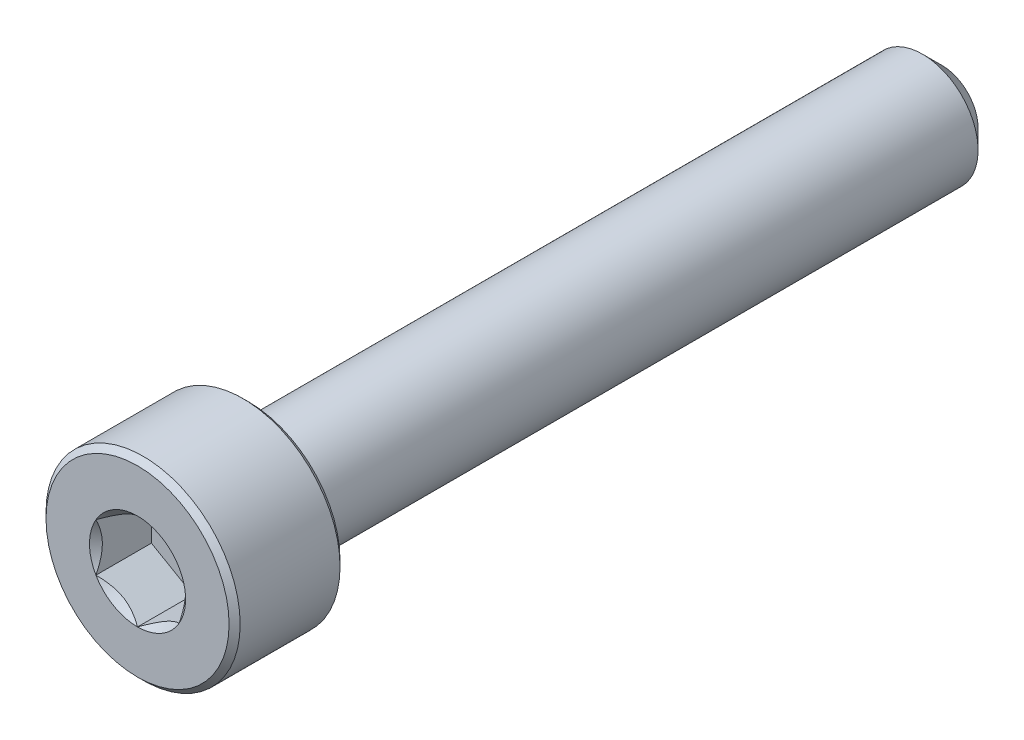
ISO-10303-21;
HEADER;
FILE_DESCRIPTION(('STEP AP214'),'2;1');
FILE_NAME('part.step','',(''),(''),'','','');
FILE_SCHEMA(('AUTOMOTIVE_DESIGN { 1 0 10303 214 1 1 1 1 }'));
ENDSEC;
DATA;
#1=APPLICATION_CONTEXT('core data for automotive mechanical design processes');
#2=APPLICATION_PROTOCOL_DEFINITION('international standard','automotive_design',2000,#1);
#3=PRODUCT_CONTEXT('',#1,'mechanical');
#4=PRODUCT('Part','Part','',(#3));
#5=PRODUCT_RELATED_PRODUCT_CATEGORY('part','',(#4));
#6=PRODUCT_DEFINITION_FORMATION('','',#4);
#7=PRODUCT_DEFINITION_CONTEXT('part definition',#1,'design');
#8=PRODUCT_DEFINITION('design','',#6,#7);
#9=PRODUCT_DEFINITION_SHAPE('','',#8);
#10=(LENGTH_UNIT() NAMED_UNIT(*) SI_UNIT(.MILLI.,.METRE.));
#11=(NAMED_UNIT(*) PLANE_ANGLE_UNIT() SI_UNIT($,.RADIAN.));
#12=(NAMED_UNIT(*) SI_UNIT($,.STERADIAN.) SOLID_ANGLE_UNIT());
#13=UNCERTAINTY_MEASURE_WITH_UNIT(LENGTH_MEASURE(1.E-05),#10,'distance_accuracy_value','');
#14=(GEOMETRIC_REPRESENTATION_CONTEXT(3) GLOBAL_UNCERTAINTY_ASSIGNED_CONTEXT((#13)) GLOBAL_UNIT_ASSIGNED_CONTEXT((#10,
#11,#12)) REPRESENTATION_CONTEXT('',''));
#15=CARTESIAN_POINT('',(0.,0.,0.));
#16=DIRECTION('',(0.,0.,1.));
#17=DIRECTION('',(1.,0.,0.));
#18=AXIS2_PLACEMENT_3D('',#15,#16,#17);
#19=CARTESIAN_POINT('',(0.,3.3,14.5));
#20=DIRECTION('',(0.,0.,1.));
#21=DIRECTION('',(1.,0.,0.));
#22=AXIS2_PLACEMENT_3D('',#19,#20,#21);
#23=PLANE('',#22);
#24=CARTESIAN_POINT('',(0.,0.,14.5));
#25=DIRECTION('',(0.,0.,1.));
#26=DIRECTION('',(1.,0.,0.));
#27=AXIS2_PLACEMENT_3D('',#24,#25,#26);
#28=CIRCLE('',#27,1.73205080756888);
#29=CARTESIAN_POINT('',(1.5,0.86602540378444,14.5));
#30=VERTEX_POINT('',#29);
#31=CARTESIAN_POINT('',(0.,1.73205080756888,14.5));
#32=VERTEX_POINT('',#31);
#33=EDGE_CURVE('E99',#30,#32,#28,.T.);
#34=ORIENTED_EDGE('',*,*,#33,.F.);
#35=CARTESIAN_POINT('',(1.5,-0.86602540378444,14.5));
#36=VERTEX_POINT('',#35);
#37=EDGE_CURVE('E59',#36,#30,#28,.T.);
#38=ORIENTED_EDGE('',*,*,#37,.F.);
#39=CARTESIAN_POINT('',(0.,-1.73205080756888,14.5));
#40=VERTEX_POINT('',#39);
#41=EDGE_CURVE('E309',#40,#36,#28,.T.);
#42=ORIENTED_EDGE('',*,*,#41,.F.);
#43=CARTESIAN_POINT('',(-1.5,-0.866025403784437,14.5));
#44=VERTEX_POINT('',#43);
#45=EDGE_CURVE('E66',#44,#40,#28,.T.);
#46=ORIENTED_EDGE('',*,*,#45,.F.);
#47=CARTESIAN_POINT('',(-1.5,0.86602540378444,14.5));
#48=VERTEX_POINT('',#47);
#49=EDGE_CURVE('E138',#48,#44,#28,.T.);
#50=ORIENTED_EDGE('',*,*,#49,.F.);
#51=EDGE_CURVE('E109',#32,#48,#28,.T.);
#52=ORIENTED_EDGE('',*,*,#51,.F.);
#53=EDGE_LOOP('',(#34,#38,#42,#46,#50,#52));
#54=FACE_BOUND('',#53,.T.);
#55=CARTESIAN_POINT('',(0.,0.,14.5));
#56=DIRECTION('',(0.,0.,-1.));
#57=DIRECTION('',(-1.,0.,0.));
#58=AXIS2_PLACEMENT_3D('',#55,#56,#57);
#59=CIRCLE('',#58,3.3);
#60=CARTESIAN_POINT('',(-3.3,0.,14.5));
#61=VERTEX_POINT('',#60);
#62=EDGE_CURVE('E53',#61,#61,#59,.T.);
#63=ORIENTED_EDGE('',*,*,#62,.F.);
#64=EDGE_LOOP('',(#63));
#65=FACE_BOUND('',#64,.T.);
#66=ADVANCED_FACE('F39',(#54,#65),#23,.T.);
#67=CARTESIAN_POINT('',(0.,0.,14.3));
#68=DIRECTION('',(0.,0.,-1.));
#69=DIRECTION('',(-1.,0.,0.));
#70=AXIS2_PLACEMENT_3D('',#67,#68,#69);
#71=CONICAL_SURFACE('',#70,3.5,0.785398163397442);
#72=ORIENTED_EDGE('',*,*,#62,.T.);
#73=EDGE_LOOP('',(#72));
#74=FACE_BOUND('',#73,.T.);
#75=CARTESIAN_POINT('',(0.,0.,14.3));
#76=DIRECTION('',(0.,0.,-1.));
#77=DIRECTION('',(-1.,0.,0.));
#78=AXIS2_PLACEMENT_3D('',#75,#76,#77);
#79=CIRCLE('',#78,3.5);
#80=CARTESIAN_POINT('',(-3.5,0.,14.3));
#81=VERTEX_POINT('',#80);
#82=EDGE_CURVE('E241',#81,#81,#79,.T.);
#83=ORIENTED_EDGE('',*,*,#82,.F.);
#84=EDGE_LOOP('',(#83));
#85=FACE_BOUND('',#84,.T.);
#86=ADVANCED_FACE('F248',(#74,#85),#71,.T.);
#87=CARTESIAN_POINT('',(0.,0.,-14.5));
#88=DIRECTION('',(0.,0.,-1.));
#89=DIRECTION('',(-1.,0.,0.));
#90=AXIS2_PLACEMENT_3D('',#87,#88,#89);
#91=CYLINDRICAL_SURFACE('',#90,3.5);
#92=ORIENTED_EDGE('',*,*,#82,.T.);
#93=EDGE_LOOP('',(#92));
#94=FACE_BOUND('',#93,.T.);
#95=CARTESIAN_POINT('',(0.,0.,10.7));
#96=DIRECTION('',(0.,0.,-1.));
#97=DIRECTION('',(-1.,0.,0.));
#98=AXIS2_PLACEMENT_3D('',#95,#96,#97);
#99=CIRCLE('',#98,3.5);
#100=CARTESIAN_POINT('',(-3.5,0.,10.7));
#101=VERTEX_POINT('',#100);
#102=EDGE_CURVE('E237',#101,#101,#99,.T.);
#103=ORIENTED_EDGE('',*,*,#102,.F.);
#104=EDGE_LOOP('',(#103));
#105=FACE_BOUND('',#104,.T.);
#106=ADVANCED_FACE('F254',(#94,#105),#91,.T.);
#107=CARTESIAN_POINT('',(0.,0.,10.5));
#108=DIRECTION('',(0.,0.,1.));
#109=DIRECTION('',(1.,0.,0.));
#110=AXIS2_PLACEMENT_3D('',#107,#108,#109);
#111=CONICAL_SURFACE('',#110,3.3,0.78539816339745);
#112=ORIENTED_EDGE('',*,*,#102,.T.);
#113=EDGE_LOOP('',(#112));
#114=FACE_BOUND('',#113,.T.);
#115=CARTESIAN_POINT('',(0.,0.,10.5));
#116=DIRECTION('',(0.,0.,-1.));
#117=DIRECTION('',(-1.,0.,0.));
#118=AXIS2_PLACEMENT_3D('',#115,#116,#117);
#119=CIRCLE('',#118,3.3);
#120=CARTESIAN_POINT('',(-3.3,0.,10.5));
#121=VERTEX_POINT('',#120);
#122=EDGE_CURVE('E233',#121,#121,#119,.T.);
#123=ORIENTED_EDGE('',*,*,#122,.F.);
#124=EDGE_LOOP('',(#123));
#125=FACE_BOUND('',#124,.T.);
#126=ADVANCED_FACE('F258',(#114,#125),#111,.T.);
#127=CARTESIAN_POINT('',(0.,3.3,10.5));
#128=DIRECTION('',(0.,0.,-1.));
#129=DIRECTION('',(-1.,0.,0.));
#130=AXIS2_PLACEMENT_3D('',#127,#128,#129);
#131=PLANE('',#130);
#132=ORIENTED_EDGE('',*,*,#122,.T.);
#133=EDGE_LOOP('',(#132));
#134=FACE_BOUND('',#133,.T.);
#135=CARTESIAN_POINT('',(0.,0.,10.5));
#136=DIRECTION('',(0.,0.,-1.));
#137=DIRECTION('',(-1.,0.,0.));
#138=AXIS2_PLACEMENT_3D('',#135,#136,#137);
#139=CIRCLE('',#138,2.);
#140=CARTESIAN_POINT('',(-2.,0.,10.5));
#141=VERTEX_POINT('',#140);
#142=EDGE_CURVE('E229',#141,#141,#139,.T.);
#143=ORIENTED_EDGE('',*,*,#142,.F.);
#144=EDGE_LOOP('',(#143));
#145=FACE_BOUND('',#144,.T.);
#146=ADVANCED_FACE('F264',(#134,#145),#131,.T.);
#147=CARTESIAN_POINT('',(0.,0.,-14.5));
#148=DIRECTION('',(0.,0.,-1.));
#149=DIRECTION('',(-1.,0.,0.));
#150=AXIS2_PLACEMENT_3D('',#147,#148,#149);
#151=CYLINDRICAL_SURFACE('',#150,2.);
#152=ORIENTED_EDGE('',*,*,#142,.T.);
#153=EDGE_LOOP('',(#152));
#154=FACE_BOUND('',#153,.T.);
#155=CARTESIAN_POINT('',(0.,0.,-13.8));
#156=DIRECTION('',(0.,0.,-1.));
#157=DIRECTION('',(-1.,0.,0.));
#158=AXIS2_PLACEMENT_3D('',#155,#156,#157);
#159=CIRCLE('',#158,2.);
#160=CARTESIAN_POINT('',(-2.,0.,-13.8));
#161=VERTEX_POINT('',#160);
#162=EDGE_CURVE('E225',#161,#161,#159,.T.);
#163=ORIENTED_EDGE('',*,*,#162,.F.);
#164=EDGE_LOOP('',(#163));
#165=FACE_BOUND('',#164,.T.);
#166=ADVANCED_FACE('F268',(#154,#165),#151,.T.);
#167=CARTESIAN_POINT('',(0.,0.,-14.5));
#168=DIRECTION('',(0.,0.,1.));
#169=DIRECTION('',(1.,0.,0.));
#170=AXIS2_PLACEMENT_3D('',#167,#168,#169);
#171=CONICAL_SURFACE('',#170,1.3,0.785398163397441);
#172=ORIENTED_EDGE('',*,*,#162,.T.);
#173=EDGE_LOOP('',(#172));
#174=FACE_BOUND('',#173,.T.);
#175=CARTESIAN_POINT('',(0.,0.,-14.5));
#176=DIRECTION('',(0.,0.,-1.));
#177=DIRECTION('',(-1.,0.,0.));
#178=AXIS2_PLACEMENT_3D('',#175,#176,#177);
#179=CIRCLE('',#178,1.3);
#180=CARTESIAN_POINT('',(-1.3,0.,-14.5));
#181=VERTEX_POINT('',#180);
#182=EDGE_CURVE('E208',#181,#181,#179,.T.);
#183=ORIENTED_EDGE('',*,*,#182,.F.);
#184=EDGE_LOOP('',(#183));
#185=FACE_BOUND('',#184,.T.);
#186=ADVANCED_FACE('F271',(#174,#185),#171,.T.);
#187=CARTESIAN_POINT('',(0.,1.3,-14.5));
#188=DIRECTION('',(0.,0.,-1.));
#189=DIRECTION('',(-1.,0.,0.));
#190=AXIS2_PLACEMENT_3D('',#187,#188,#189);
#191=PLANE('',#190);
#192=ORIENTED_EDGE('',*,*,#182,.T.);
#193=EDGE_LOOP('',(#192));
#194=FACE_BOUND('',#193,.T.);
#195=ADVANCED_FACE('F174',(#194),#191,.T.);
#196=CARTESIAN_POINT('',(0.,0.,14.5));
#197=DIRECTION('',(0.,0.,1.));
#198=DIRECTION('',(1.,0.,0.));
#199=AXIS2_PLACEMENT_3D('',#196,#197,#198);
#200=CONICAL_SURFACE('',#199,1.73205080756888,0.78539816339745);
#201=ORIENTED_EDGE('',*,*,#51,.T.);
#202=CARTESIAN_POINT('',(0.000200000000000415,1.73216627762272,14.5001154816001));
#203=CARTESIAN_POINT('',(-0.0513677907370748,1.70239359975915,14.4703654760673));
#204=CARTESIAN_POINT('',(-0.1037979176652,1.67212305186355,14.4423624839103));
#205=CARTESIAN_POINT('',(-0.210709034055596,1.61039789003619,14.3910892304401));
#206=CARTESIAN_POINT('',(-0.26520019581466,1.57893740312614,14.3678475050444));
#207=CARTESIAN_POINT('',(-0.375079081357248,1.51549879897987,14.3280337289922));
#208=CARTESIAN_POINT('',(-0.430438809095199,1.4835368452681,14.3113615856709));
#209=CARTESIAN_POINT('',(-0.54237725747715,1.41890915196211,14.2856744568181));
#210=CARTESIAN_POINT('',(-0.598952556553008,1.38624538781118,14.2766402904789));
#211=CARTESIAN_POINT('',(-0.69645538951644,1.329952100953,14.2684890812269));
#212=CARTESIAN_POINT('',(-0.737256908280465,1.30639533311124,14.2672822529892));
#213=CARTESIAN_POINT('',(-0.818787969615858,1.25932335290194,14.2693140571623));
#214=CARTESIAN_POINT('',(-0.859517494314629,1.23580815085313,14.2725536707483));
#215=CARTESIAN_POINT('',(-0.940584402163415,1.18900414978427,14.283291985982));
#216=CARTESIAN_POINT('',(-0.980921384598287,1.1657155821172,14.2907946530187));
#217=CARTESIAN_POINT('',(-1.06091833691403,1.11952932016335,14.3096516119283));
#218=CARTESIAN_POINT('',(-1.10057800851621,1.09663179808786,14.3210075570186));
#219=CARTESIAN_POINT('',(-1.20216313477448,1.03798159809698,14.3547216475927));
#220=CARTESIAN_POINT('',(-1.26345855370969,1.00259267147465,14.3796218490934));
#221=CARTESIAN_POINT('',(-1.35358562846331,0.950557780604375,14.4216566532716));
#222=CARTESIAN_POINT('',(-1.38328513990772,0.933410759677148,14.4364251535591));
#223=CARTESIAN_POINT('',(-1.44213790138375,0.899432101996407,14.4673105659402));
#224=CARTESIAN_POINT('',(-1.47129140422064,0.88260031928571,14.4834268341217));
#225=CARTESIAN_POINT('',(-1.5002,0.865909933730601,14.5001154816001));
#226=B_SPLINE_CURVE_WITH_KNOTS('',3,(#202,#203,#204,#205,#206,#207,#208,#209,#210,#211,#212,
#213,#214,#215,#216,#217,#218,#219,#220,#221,#222,#223,#224,#225),.UNSPECIFIED.,.F.,.F.,(4,2,2,
2,2,2,2,2,2,2,2,4),(0.,0.199829143693304,0.400822987382388,0.59862372053818,0.795926240188889,
0.937113067959881,1.07833105577193,1.21968061668222,1.36109089931054,1.58570969637566,
1.69770705470964,1.80965120737194),.UNSPECIFIED.);
#227=EDGE_CURVE('E11',#32,#48,#226,.T.);
#228=ORIENTED_EDGE('',*,*,#227,.F.);
#229=EDGE_LOOP('',(#201,#228));
#230=FACE_BOUND('',#229,.T.);
#231=ADVANCED_FACE('F113',(#230),#200,.F.);
#232=ORIENTED_EDGE('',*,*,#49,.T.);
#233=CARTESIAN_POINT('',(-1.5,-1.70094076570699,15.0358115093375));
#234=CARTESIAN_POINT('',(-1.5,-1.65940339844307,15.0046624535631));
#235=CARTESIAN_POINT('',(-1.5,-1.61763176138548,14.9738266460381));
#236=CARTESIAN_POINT('',(-1.5,-1.53352581710889,14.9129100581704));
#237=CARTESIAN_POINT('',(-1.5,-1.49119136858461,14.8828294731344));
#238=CARTESIAN_POINT('',(-1.5,-1.36258344501966,14.7934848296331));
#239=CARTESIAN_POINT('',(-1.5,-1.27533705988673,14.7355978134878));
#240=CARTESIAN_POINT('',(-1.5,-1.09255216894207,14.6221956742968));
#241=CARTESIAN_POINT('',(-1.5,-0.996821581803491,14.5669865475731));
#242=CARTESIAN_POINT('',(-1.5,-0.80061308229159,14.4661637894456));
#243=CARTESIAN_POINT('',(-1.5,-0.700152604862087,14.4205178517796));
#244=CARTESIAN_POINT('',(-1.5,-0.549105960820993,14.3646825296987));
#245=CARTESIAN_POINT('',(-1.5,-0.50070074362804,14.3486143923262));
#246=CARTESIAN_POINT('',(-1.5,-0.40274469507941,14.3203677225147));
#247=CARTESIAN_POINT('',(-1.5,-0.353193782853662,14.3081894655512));
#248=CARTESIAN_POINT('',(-1.5,-0.254057869430009,14.2885509139904));
#249=CARTESIAN_POINT('',(-1.5,-0.204488814603775,14.2810113615859));
#250=CARTESIAN_POINT('',(-1.5,-0.104849462627796,14.2707932169289));
#251=CARTESIAN_POINT('',(-1.5,-0.0547792475757581,14.2681138411974));
#252=CARTESIAN_POINT('',(-1.5,0.0436737229088438,14.2678046268618));
#253=CARTESIAN_POINT('',(-1.5,0.0920560164094801,14.2700063307259));
#254=CARTESIAN_POINT('',(-1.5,0.188397733218518,14.2789725882362));
#255=CARTESIAN_POINT('',(-1.5,0.236357072029981,14.285738033594));
#256=CARTESIAN_POINT('',(-1.5,0.332310053939587,14.3035816390129));
#257=CARTESIAN_POINT('',(-1.5,0.380290051019947,14.3147320967868));
#258=CARTESIAN_POINT('',(-1.5,0.475204866701383,14.3407610618773));
#259=CARTESIAN_POINT('',(-1.5,0.522139781196709,14.3556392256008));
#260=CARTESIAN_POINT('',(-1.5,0.67113584923772,14.4084343926817));
#261=CARTESIAN_POINT('',(-1.5,0.771043708402957,14.4524144964364));
#262=CARTESIAN_POINT('',(-1.5,0.96615432077171,14.5501619481606));
#263=CARTESIAN_POINT('',(-1.5,1.06133841027247,14.6039647104964));
#264=CARTESIAN_POINT('',(-1.5,1.24322962123133,14.7149242663436));
#265=CARTESIAN_POINT('',(-1.5,1.33012275327054,14.7717798884629));
#266=CARTESIAN_POINT('',(-1.5,1.45814294533514,14.8596557398234));
#267=CARTESIAN_POINT('',(-1.5,1.50026316125082,14.8892542436258));
#268=CARTESIAN_POINT('',(-1.5,1.58392901779071,14.9492295725282));
#269=CARTESIAN_POINT('',(-1.5,1.62547481197907,14.9796061831648));
#270=CARTESIAN_POINT('',(-1.5,1.66678158585385,15.0103052870204));
#271=B_SPLINE_CURVE_WITH_KNOTS('',3,(#233,#234,#235,#236,#237,#238,#239,#240,#241,#242,#243,
#244,#245,#246,#247,#248,#249,#250,#251,#252,#253,#254,#255,#256,#257,#258,#259,#260,#261,#262,
#263,#264,#265,#266,#267,#268,#269,#270),.UNSPECIFIED.,.F.,.F.,(4,2,2,2,2,2,2,2,2,2,2,2,2,2,2,2,
2,2,4),(0.,0.155753948201002,0.311547769199354,0.625513832410583,0.95676361465448,
1.28687565594417,1.43975300144579,1.59264117109685,1.74283872260253,1.89301205954152,
2.03808349452257,2.1831832832956,2.33078307442231,2.47836926586908,2.80488410158813,
3.13260026706957,3.44396956433299,3.59840353500356,3.75279538879849),.UNSPECIFIED.);
#272=EDGE_CURVE('E108',#48,#44,#271,.F.);
#273=ORIENTED_EDGE('',*,*,#272,.F.);
#274=EDGE_LOOP('',(#232,#273));
#275=FACE_BOUND('',#274,.T.);
#276=ADVANCED_FACE('F286',(#275),#200,.F.);
#277=ORIENTED_EDGE('',*,*,#45,.T.);
#278=CARTESIAN_POINT('',(-1.5002,-0.865909933730601,14.5001154816001));
#279=CARTESIAN_POINT('',(-1.44863220926292,-0.895682611594166,14.4703654760673));
#280=CARTESIAN_POINT('',(-1.3962020823348,-0.925953159489765,14.4423624839103));
#281=CARTESIAN_POINT('',(-1.2892909659444,-0.987678321317123,14.3910892304401));
#282=CARTESIAN_POINT('',(-1.23479980418534,-1.01913880822717,14.3678475050444));
#283=CARTESIAN_POINT('',(-1.12492091864275,-1.08257741237344,14.3280337289922));
#284=CARTESIAN_POINT('',(-1.0695611909048,-1.11453936608521,14.3113615856709));
#285=CARTESIAN_POINT('',(-0.957622742522851,-1.1791670593912,14.2856744568181));
#286=CARTESIAN_POINT('',(-0.901047443446993,-1.21183082354213,14.2766402904789));
#287=CARTESIAN_POINT('',(-0.803544610483561,-1.26812411040032,14.2684890812269));
#288=CARTESIAN_POINT('',(-0.762743091719535,-1.29168087824208,14.2672822529892));
#289=CARTESIAN_POINT('',(-0.681212030384143,-1.33875285845138,14.2693140571623));
#290=CARTESIAN_POINT('',(-0.640482505685372,-1.36226806050018,14.2725536707483));
#291=CARTESIAN_POINT('',(-0.559415597836586,-1.40907206156905,14.283291985982));
#292=CARTESIAN_POINT('',(-0.519078615401714,-1.43236062923612,14.2907946530187));
#293=CARTESIAN_POINT('',(-0.439081663085971,-1.47854689118996,14.3096516119283));
#294=CARTESIAN_POINT('',(-0.399421991483794,-1.50144441326545,14.3210075570186));
#295=CARTESIAN_POINT('',(-0.297836865225516,-1.56009461325633,14.3547216475927));
#296=CARTESIAN_POINT('',(-0.236541446290312,-1.59548353987866,14.3796218490934));
#297=CARTESIAN_POINT('',(-0.146414371536687,-1.64751843074894,14.4216566532716));
#298=CARTESIAN_POINT('',(-0.116714860092283,-1.66466545167617,14.4364251535591));
#299=CARTESIAN_POINT('',(-0.0578620986162496,-1.69864410935691,14.4673105659402));
#300=CARTESIAN_POINT('',(-0.0287085957793634,-1.71547589206761,14.4834268341217));
#301=CARTESIAN_POINT('',(0.000199999999999558,-1.73216627762272,14.5001154816001));
#302=B_SPLINE_CURVE_WITH_KNOTS('',3,(#278,#279,#280,#281,#282,#283,#284,#285,#286,#287,#288,
#289,#290,#291,#292,#293,#294,#295,#296,#297,#298,#299,#300,#301),.UNSPECIFIED.,.F.,.F.,(4,2,2,
2,2,2,2,2,2,2,2,4),(0.,0.199829143693304,0.400822987382388,0.59862372053818,0.795926240188888,
0.93711306795988,1.07833105577193,1.21968061668222,1.36109089931054,1.58570969637565,
1.69770705470964,1.80965120737194),.UNSPECIFIED.);
#303=EDGE_CURVE('E150',#44,#40,#302,.T.);
#304=ORIENTED_EDGE('',*,*,#303,.F.);
#305=EDGE_LOOP('',(#277,#304));
#306=FACE_BOUND('',#305,.T.);
#307=ADVANCED_FACE('F290',(#306),#200,.F.);
#308=ORIENTED_EDGE('',*,*,#41,.T.);
#309=CARTESIAN_POINT('',(-0.000200000000000533,-1.73216627762272,14.5001154816001));
#310=CARTESIAN_POINT('',(0.0513677907370749,-1.70239359975915,14.4703654760673));
#311=CARTESIAN_POINT('',(0.1037979176652,-1.67212305186355,14.4423624839103));
#312=CARTESIAN_POINT('',(0.210709034055596,-1.61039789003619,14.3910892304401));
#313=CARTESIAN_POINT('',(0.26520019581466,-1.57893740312614,14.3678475050444));
#314=CARTESIAN_POINT('',(0.375079081357248,-1.51549879897987,14.3280337289922));
#315=CARTESIAN_POINT('',(0.430438809095199,-1.4835368452681,14.3113615856709));
#316=CARTESIAN_POINT('',(0.54237725747715,-1.41890915196211,14.2856744568181));
#317=CARTESIAN_POINT('',(0.598952556553008,-1.38624538781118,14.2766402904789));
#318=CARTESIAN_POINT('',(0.69645538951644,-1.329952100953,14.2684890812269));
#319=CARTESIAN_POINT('',(0.737256908280465,-1.30639533311124,14.2672822529892));
#320=CARTESIAN_POINT('',(0.818787969615857,-1.25932335290194,14.2693140571623));
#321=CARTESIAN_POINT('',(0.859517494314629,-1.23580815085313,14.2725536707483));
#322=CARTESIAN_POINT('',(0.940584402163415,-1.18900414978427,14.283291985982));
#323=CARTESIAN_POINT('',(0.980921384598287,-1.1657155821172,14.2907946530187));
#324=CARTESIAN_POINT('',(1.06091833691403,-1.11952932016335,14.3096516119283));
#325=CARTESIAN_POINT('',(1.10057800851621,-1.09663179808786,14.3210075570186));
#326=CARTESIAN_POINT('',(1.20216313477448,-1.03798159809698,14.3547216475927));
#327=CARTESIAN_POINT('',(1.26345855370969,-1.00259267147465,14.3796218490934));
#328=CARTESIAN_POINT('',(1.35358562846331,-0.950557780604376,14.4216566532716));
#329=CARTESIAN_POINT('',(1.38328513990772,-0.933410759677149,14.4364251535591));
#330=CARTESIAN_POINT('',(1.44213790138375,-0.899432101996408,14.4673105659402));
#331=CARTESIAN_POINT('',(1.47129140422064,-0.882600319285711,14.4834268341217));
#332=CARTESIAN_POINT('',(1.5002,-0.865909933730602,14.5001154816001));
#333=B_SPLINE_CURVE_WITH_KNOTS('',3,(#309,#310,#311,#312,#313,#314,#315,#316,#317,#318,#319,
#320,#321,#322,#323,#324,#325,#326,#327,#328,#329,#330,#331,#332),.UNSPECIFIED.,.F.,.F.,(4,2,2,
2,2,2,2,2,2,2,2,4),(0.,0.199829143693304,0.400822987382388,0.59862372053818,0.795926240188889,
0.93711306795988,1.07833105577193,1.21968061668222,1.36109089931054,1.58570969637565,
1.69770705470963,1.80965120737194),.UNSPECIFIED.);
#334=EDGE_CURVE('E311',#40,#36,#333,.T.);
#335=ORIENTED_EDGE('',*,*,#334,.F.);
#336=EDGE_LOOP('',(#308,#335));
#337=FACE_BOUND('',#336,.T.);
#338=ADVANCED_FACE('F299',(#337),#200,.F.);
#339=ORIENTED_EDGE('',*,*,#37,.T.);
#340=CARTESIAN_POINT('',(1.5,-1.70094076506827,15.0358115088584));
#341=CARTESIAN_POINT('',(1.5,-1.65940339782208,15.0046624531024));
#342=CARTESIAN_POINT('',(1.5,-1.61763176078228,14.9738266455959));
#343=CARTESIAN_POINT('',(1.5,-1.53352581654145,14.9129100577648));
#344=CARTESIAN_POINT('',(1.5,-1.49119136803515,14.882829472747));
#345=CARTESIAN_POINT('',(1.5,-1.36258344452521,14.793484829301));
#346=CARTESIAN_POINT('',(1.5,-1.2753370594297,14.7355978131923));
#347=CARTESIAN_POINT('',(1.5,-1.09255216856664,14.6221956740766));
#348=CARTESIAN_POINT('',(1.5,-0.996821581472455,14.5669865473912));
#349=CARTESIAN_POINT('',(1.5,-0.800613082053126,14.4661637893348));
#350=CARTESIAN_POINT('',(1.5,-0.70015260467177,14.4205178517016));
#351=CARTESIAN_POINT('',(1.5,-0.549105960667007,14.3646825296453));
#352=CARTESIAN_POINT('',(1.5,-0.500700743459034,14.3486143922722));
#353=CARTESIAN_POINT('',(1.5,-0.402744694879907,14.3203677224624));
#354=CARTESIAN_POINT('',(1.5,-0.35319378263868,14.3081894655014));
#355=CARTESIAN_POINT('',(1.5,-0.254057869184596,14.2885509139489));
#356=CARTESIAN_POINT('',(1.5,-0.204488814343417,14.2810113615502));
#357=CARTESIAN_POINT('',(1.5,-0.104849462338083,14.2707932169081));
#358=CARTESIAN_POINT('',(1.5,-0.0547792472716361,14.2681138411859));
#359=CARTESIAN_POINT('',(1.5,0.0436737232403028,14.267804626871));
#360=CARTESIAN_POINT('',(1.5,0.0920560167539031,14.2700063307466));
#361=CARTESIAN_POINT('',(1.5,0.188397733587633,14.2789725882818));
#362=CARTESIAN_POINT('',(1.5,0.236357072410824,14.2857380336531));
#363=CARTESIAN_POINT('',(1.5,0.332310054343575,14.3035816391));
#364=CARTESIAN_POINT('',(1.5,0.380290051435318,14.3147320968888));
#365=CARTESIAN_POINT('',(1.5,0.475204867138458,14.3407610620092));
#366=CARTESIAN_POINT('',(1.5,0.522139781644104,14.3556392257479));
#367=CARTESIAN_POINT('',(1.5,0.671135849783408,14.4084343929006));
#368=CARTESIAN_POINT('',(1.5,0.771043709031689,14.4524144967216));
#369=CARTESIAN_POINT('',(1.5,0.96615432156016,14.5501619485856));
#370=CARTESIAN_POINT('',(1.5,1.06133841113756,14.603964710995));
#371=CARTESIAN_POINT('',(1.5,1.24322962223427,14.714924266983));
#372=CARTESIAN_POINT('',(1.5,1.33012275433518,14.7717798891689));
#373=CARTESIAN_POINT('',(1.5,1.45814294649102,14.859655740629));
#374=CARTESIAN_POINT('',(1.5,1.50026316243668,14.8892542444644));
#375=CARTESIAN_POINT('',(1.5,1.58392901903632,14.9492295734326));
#376=CARTESIAN_POINT('',(1.5,1.62547481325447,14.9796061841021));
#377=CARTESIAN_POINT('',(1.5,1.66678158715899,15.0103052879905));
#378=B_SPLINE_CURVE_WITH_KNOTS('',3,(#340,#341,#342,#343,#344,#345,#346,#347,#348,#349,#350,
#351,#352,#353,#354,#355,#356,#357,#358,#359,#360,#361,#362,#363,#364,#365,#366,#367,#368,#369,
#370,#371,#372,#373,#374,#375,#376,#377),.UNSPECIFIED.,.F.,.F.,(4,2,2,2,2,2,2,2,2,2,2,2,2,2,2,2,
2,2,4),(0.,0.155753948125309,0.311547769047943,0.625513832104915,0.95676361417602,
1.28687565529455,1.43975300083937,1.59264117053357,1.74283872208071,1.89301205906115,
2.03808349408246,2.18318328289585,2.33078307406584,2.47836926555587,2.80488410158167,
3.13260026737189,3.44396956489968,3.59840353570064,3.75279538962595),.UNSPECIFIED.);
#379=EDGE_CURVE('E126',#36,#30,#378,.T.);
#380=ORIENTED_EDGE('',*,*,#379,.F.);
#381=EDGE_LOOP('',(#339,#380));
#382=FACE_BOUND('',#381,.T.);
#383=ADVANCED_FACE('F293',(#382),#200,.F.);
#384=ORIENTED_EDGE('',*,*,#33,.T.);
#385=CARTESIAN_POINT('',(1.5002,0.865909933730602,14.5001154816001));
#386=CARTESIAN_POINT('',(1.44863220926292,0.895682611594167,14.4703654760673));
#387=CARTESIAN_POINT('',(1.3962020823348,0.925953159489766,14.4423624839103));
#388=CARTESIAN_POINT('',(1.2892909659444,0.987678321317125,14.3910892304401));
#389=CARTESIAN_POINT('',(1.23479980418534,1.01913880822718,14.3678475050444));
#390=CARTESIAN_POINT('',(1.12492091864275,1.08257741237344,14.3280337289922));
#391=CARTESIAN_POINT('',(1.0695611909048,1.11453936608522,14.3113615856709));
#392=CARTESIAN_POINT('',(0.957622742522848,1.1791670593912,14.2856744568181));
#393=CARTESIAN_POINT('',(0.90104744344699,1.21183082354213,14.2766402904789));
#394=CARTESIAN_POINT('',(0.803544610483558,1.26812411040032,14.2684890812269));
#395=CARTESIAN_POINT('',(0.762743091719533,1.29168087824208,14.2672822529892));
#396=CARTESIAN_POINT('',(0.681212030384141,1.33875285845138,14.2693140571623));
#397=CARTESIAN_POINT('',(0.640482505685369,1.36226806050018,14.2725536707483));
#398=CARTESIAN_POINT('',(0.559415597836583,1.40907206156905,14.283291985982));
#399=CARTESIAN_POINT('',(0.51907861540171,1.43236062923612,14.2907946530187));
#400=CARTESIAN_POINT('',(0.439081663085968,1.47854689118997,14.3096516119283));
#401=CARTESIAN_POINT('',(0.399421991483791,1.50144441326545,14.3210075570186));
#402=CARTESIAN_POINT('',(0.297836865225514,1.56009461325633,14.3547216475927));
#403=CARTESIAN_POINT('',(0.23654144629031,1.59548353987866,14.3796218490934));
#404=CARTESIAN_POINT('',(0.146414371536686,1.64751843074894,14.4216566532716));
#405=CARTESIAN_POINT('',(0.116714860092281,1.66466545167617,14.4364251535591));
#406=CARTESIAN_POINT('',(0.0578620986162485,1.69864410935691,14.4673105659402));
#407=CARTESIAN_POINT('',(0.0287085957793627,1.71547589206761,14.4834268341217));
#408=CARTESIAN_POINT('',(-0.000199999999999666,1.73216627762272,14.5001154816001));
#409=B_SPLINE_CURVE_WITH_KNOTS('',3,(#385,#386,#387,#388,#389,#390,#391,#392,#393,#394,#395,
#396,#397,#398,#399,#400,#401,#402,#403,#404,#405,#406,#407,#408),.UNSPECIFIED.,.F.,.F.,(4,2,2,
2,2,2,2,2,2,2,2,4),(0.,0.199829143693305,0.400822987382389,0.598623720538181,0.795926240188889,
0.937113067959881,1.07833105577193,1.21968061668222,1.36109089931055,1.58570969637565,
1.69770705470964,1.80965120737194),.UNSPECIFIED.);
#410=EDGE_CURVE('E103',#30,#32,#409,.T.);
#411=ORIENTED_EDGE('',*,*,#410,.F.);
#412=EDGE_LOOP('',(#384,#411));
#413=FACE_BOUND('',#412,.T.);
#414=ADVANCED_FACE('F101',(#413),#200,.F.);
#415=CARTESIAN_POINT('',(0.,0.,12.5));
#416=DIRECTION('',(0.,0.,1.));
#417=DIRECTION('',(1.,0.,0.));
#418=AXIS2_PLACEMENT_3D('',#415,#416,#417);
#419=PLANE('',#418);
#420=DIRECTION('',(-0.866025403784439,0.5,0.));
#421=VECTOR('',#420,1.);
#422=CARTESIAN_POINT('',(1.5,0.86602540378444,12.5));
#423=LINE('',#422,#421);
#424=CARTESIAN_POINT('',(1.5,0.86602540378444,12.5));
#425=VERTEX_POINT('',#424);
#426=CARTESIAN_POINT('',(0.,1.73205080756888,12.5));
#427=VERTEX_POINT('',#426);
#428=EDGE_CURVE('E125',#425,#427,#423,.T.);
#429=ORIENTED_EDGE('',*,*,#428,.T.);
#430=DIRECTION('',(-0.866025403784439,-0.5,0.));
#431=VECTOR('',#430,1.);
#432=CARTESIAN_POINT('',(0.,1.73205080756888,12.5));
#433=LINE('',#432,#431);
#434=CARTESIAN_POINT('',(-1.5,0.866025403784439,12.5));
#435=VERTEX_POINT('',#434);
#436=EDGE_CURVE('E130',#427,#435,#433,.T.);
#437=ORIENTED_EDGE('',*,*,#436,.T.);
#438=DIRECTION('',(0.,-1.,0.));
#439=VECTOR('',#438,1.);
#440=CARTESIAN_POINT('',(-1.5,0.866025403784439,12.5));
#441=LINE('',#440,#439);
#442=CARTESIAN_POINT('',(-1.5,-0.866025403784439,12.5));
#443=VERTEX_POINT('',#442);
#444=EDGE_CURVE('E191',#435,#443,#441,.T.);
#445=ORIENTED_EDGE('',*,*,#444,.T.);
#446=DIRECTION('',(0.866025403784439,-0.5,0.));
#447=VECTOR('',#446,1.);
#448=CARTESIAN_POINT('',(-1.5,-0.866025403784439,12.5));
#449=LINE('',#448,#447);
#450=CARTESIAN_POINT('',(0.,-1.73205080756888,12.5));
#451=VERTEX_POINT('',#450);
#452=EDGE_CURVE('E195',#443,#451,#449,.T.);
#453=ORIENTED_EDGE('',*,*,#452,.T.);
#454=DIRECTION('',(0.866025403784439,0.5,0.));
#455=VECTOR('',#454,1.);
#456=CARTESIAN_POINT('',(0.,-1.73205080756888,12.5));
#457=LINE('',#456,#455);
#458=CARTESIAN_POINT('',(1.5,-0.86602540378444,12.5));
#459=VERTEX_POINT('',#458);
#460=EDGE_CURVE('E199',#451,#459,#457,.T.);
#461=ORIENTED_EDGE('',*,*,#460,.T.);
#462=DIRECTION('',(0.,1.,0.));
#463=VECTOR('',#462,1.);
#464=CARTESIAN_POINT('',(1.5,-0.86602540378444,12.5));
#465=LINE('',#464,#463);
#466=EDGE_CURVE('E134',#459,#425,#465,.T.);
#467=ORIENTED_EDGE('',*,*,#466,.T.);
#468=EDGE_LOOP('',(#429,#437,#445,#453,#461,#467));
#469=FACE_BOUND('',#468,.T.);
#470=ADVANCED_FACE('F169',(#469),#419,.T.);
#471=CARTESIAN_POINT('',(0.,1.73205080756888,12.5));
#472=DIRECTION('',(-0.5,0.866025403784439,0.));
#473=DIRECTION('',(-0.866025403784439,-0.5,0.));
#474=AXIS2_PLACEMENT_3D('',#471,#472,#473);
#475=PLANE('',#474);
#476=DIRECTION('',(0.,0.,1.));
#477=VECTOR('',#476,1.);
#478=CARTESIAN_POINT('',(0.,1.73205080756888,12.5));
#479=LINE('',#478,#477);
#480=EDGE_CURVE('E121',#427,#32,#479,.T.);
#481=ORIENTED_EDGE('',*,*,#480,.T.);
#482=ORIENTED_EDGE('',*,*,#227,.T.);
#483=DIRECTION('',(0.,0.,1.));
#484=VECTOR('',#483,1.);
#485=CARTESIAN_POINT('',(-1.5,0.866025403784439,12.5));
#486=LINE('',#485,#484);
#487=EDGE_CURVE('E133',#435,#48,#486,.T.);
#488=ORIENTED_EDGE('',*,*,#487,.F.);
#489=ORIENTED_EDGE('',*,*,#436,.F.);
#490=EDGE_LOOP('',(#481,#482,#488,#489));
#491=FACE_BOUND('',#490,.T.);
#492=ADVANCED_FACE('F128',(#491),#475,.F.);
#493=CARTESIAN_POINT('',(-1.5,0.866025403784439,12.5));
#494=DIRECTION('',(-1.,0.,0.));
#495=DIRECTION('',(0.,-1.,0.));
#496=AXIS2_PLACEMENT_3D('',#493,#494,#495);
#497=PLANE('',#496);
#498=ORIENTED_EDGE('',*,*,#487,.T.);
#499=ORIENTED_EDGE('',*,*,#272,.T.);
#500=DIRECTION('',(0.,0.,1.));
#501=VECTOR('',#500,1.);
#502=CARTESIAN_POINT('',(-1.5,-0.866025403784439,12.5));
#503=LINE('',#502,#501);
#504=EDGE_CURVE('E216',#443,#44,#503,.T.);
#505=ORIENTED_EDGE('',*,*,#504,.F.);
#506=ORIENTED_EDGE('',*,*,#444,.F.);
#507=EDGE_LOOP('',(#498,#499,#505,#506));
#508=FACE_BOUND('',#507,.T.);
#509=ADVANCED_FACE('F159',(#508),#497,.F.);
#510=CARTESIAN_POINT('',(-1.5,-0.866025403784439,12.5));
#511=DIRECTION('',(-0.5,-0.866025403784439,0.));
#512=DIRECTION('',(0.866025403784439,-0.5,0.));
#513=AXIS2_PLACEMENT_3D('',#510,#511,#512);
#514=PLANE('',#513);
#515=ORIENTED_EDGE('',*,*,#504,.T.);
#516=ORIENTED_EDGE('',*,*,#303,.T.);
#517=DIRECTION('',(0.,0.,1.));
#518=VECTOR('',#517,1.);
#519=CARTESIAN_POINT('',(0.,-1.73205080756888,12.5));
#520=LINE('',#519,#518);
#521=EDGE_CURVE('E212',#451,#40,#520,.T.);
#522=ORIENTED_EDGE('',*,*,#521,.F.);
#523=ORIENTED_EDGE('',*,*,#452,.F.);
#524=EDGE_LOOP('',(#515,#516,#522,#523));
#525=FACE_BOUND('',#524,.T.);
#526=ADVANCED_FACE('F162',(#525),#514,.F.);
#527=CARTESIAN_POINT('',(0.,-1.73205080756888,12.5));
#528=DIRECTION('',(0.5,-0.866025403784439,0.));
#529=DIRECTION('',(0.866025403784439,0.5,0.));
#530=AXIS2_PLACEMENT_3D('',#527,#528,#529);
#531=PLANE('',#530);
#532=ORIENTED_EDGE('',*,*,#521,.T.);
#533=ORIENTED_EDGE('',*,*,#334,.T.);
#534=DIRECTION('',(0.,0.,1.));
#535=VECTOR('',#534,1.);
#536=CARTESIAN_POINT('',(1.5,-0.86602540378444,12.5));
#537=LINE('',#536,#535);
#538=EDGE_CURVE('E209',#459,#36,#537,.T.);
#539=ORIENTED_EDGE('',*,*,#538,.F.);
#540=ORIENTED_EDGE('',*,*,#460,.F.);
#541=EDGE_LOOP('',(#532,#533,#539,#540));
#542=FACE_BOUND('',#541,.T.);
#543=ADVANCED_FACE('F322',(#542),#531,.F.);
#544=CARTESIAN_POINT('',(1.5,-0.86602540378444,12.5));
#545=DIRECTION('',(1.,0.,0.));
#546=DIRECTION('',(0.,0.,-1.));
#547=AXIS2_PLACEMENT_3D('',#544,#545,#546);
#548=PLANE('',#547);
#549=ORIENTED_EDGE('',*,*,#538,.T.);
#550=ORIENTED_EDGE('',*,*,#379,.T.);
#551=DIRECTION('',(0.,0.,1.));
#552=VECTOR('',#551,1.);
#553=CARTESIAN_POINT('',(1.5,0.86602540378444,12.5));
#554=LINE('',#553,#552);
#555=EDGE_CURVE('E123',#425,#30,#554,.T.);
#556=ORIENTED_EDGE('',*,*,#555,.F.);
#557=ORIENTED_EDGE('',*,*,#466,.F.);
#558=EDGE_LOOP('',(#549,#550,#556,#557));
#559=FACE_BOUND('',#558,.T.);
#560=ADVANCED_FACE('F173',(#559),#548,.F.);
#561=CARTESIAN_POINT('',(1.5,0.86602540378444,12.5));
#562=DIRECTION('',(0.5,0.866025403784439,0.));
#563=DIRECTION('',(-0.866025403784439,0.5,0.));
#564=AXIS2_PLACEMENT_3D('',#561,#562,#563);
#565=PLANE('',#564);
#566=ORIENTED_EDGE('',*,*,#555,.T.);
#567=ORIENTED_EDGE('',*,*,#410,.T.);
#568=ORIENTED_EDGE('',*,*,#480,.F.);
#569=ORIENTED_EDGE('',*,*,#428,.F.);
#570=EDGE_LOOP('',(#566,#567,#568,#569));
#571=FACE_BOUND('',#570,.T.);
#572=ADVANCED_FACE('F119',(#571),#565,.F.);
#573=CLOSED_SHELL('',(#66,#86,#106,#126,#146,#166,#186,#195,#231,#276,#307,#338,#383,#414,#470,
#492,#509,#526,#543,#560,#572));
#574=MANIFOLD_SOLID_BREP('B2',#573);
#575=ADVANCED_BREP_SHAPE_REPRESENTATION('',(#18,#574),#14);
#576=SHAPE_DEFINITION_REPRESENTATION(#9,#575);
ENDSEC;
END-ISO-10303-21;
